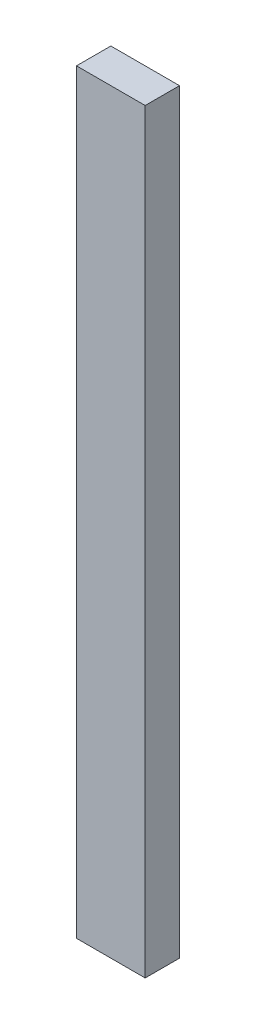
ISO-10303-21;
HEADER;
FILE_DESCRIPTION(('STEP AP214'),'2;1');
FILE_NAME('part.step','',(''),(''),'','','');
FILE_SCHEMA(('AUTOMOTIVE_DESIGN { 1 0 10303 214 1 1 1 1 }'));
ENDSEC;
DATA;
#1=APPLICATION_CONTEXT('core data for automotive mechanical design processes');
#2=APPLICATION_PROTOCOL_DEFINITION('international standard','automotive_design',2000,#1);
#3=PRODUCT_CONTEXT('',#1,'mechanical');
#4=PRODUCT('Part','Part','',(#3));
#5=PRODUCT_RELATED_PRODUCT_CATEGORY('part','',(#4));
#6=PRODUCT_DEFINITION_FORMATION('','',#4);
#7=PRODUCT_DEFINITION_CONTEXT('part definition',#1,'design');
#8=PRODUCT_DEFINITION('design','',#6,#7);
#9=PRODUCT_DEFINITION_SHAPE('','',#8);
#10=(LENGTH_UNIT() NAMED_UNIT(*) SI_UNIT(.MILLI.,.METRE.));
#11=(NAMED_UNIT(*) PLANE_ANGLE_UNIT() SI_UNIT($,.RADIAN.));
#12=(NAMED_UNIT(*) SI_UNIT($,.STERADIAN.) SOLID_ANGLE_UNIT());
#13=UNCERTAINTY_MEASURE_WITH_UNIT(LENGTH_MEASURE(1.E-05),#10,'distance_accuracy_value','');
#14=(GEOMETRIC_REPRESENTATION_CONTEXT(3) GLOBAL_UNCERTAINTY_ASSIGNED_CONTEXT((#13)) GLOBAL_UNIT_ASSIGNED_CONTEXT((#10,
#11,#12)) REPRESENTATION_CONTEXT('',''));
#15=CARTESIAN_POINT('',(0.,0.,0.));
#16=DIRECTION('',(0.,0.,1.));
#17=DIRECTION('',(1.,0.,0.));
#18=AXIS2_PLACEMENT_3D('',#15,#16,#17);
#19=CARTESIAN_POINT('',(12.7,-139.7,-12.7));
#20=DIRECTION('',(1.,0.,0.));
#21=DIRECTION('',(0.,0.,-1.));
#22=AXIS2_PLACEMENT_3D('',#19,#20,#21);
#23=PLANE('',#22);
#24=DIRECTION('',(0.,1.,0.));
#25=VECTOR('',#24,1.);
#26=CARTESIAN_POINT('',(12.7,-139.7,0.));
#27=LINE('',#26,#25);
#28=CARTESIAN_POINT('',(12.7,-139.7,0.));
#29=VERTEX_POINT('',#28);
#30=CARTESIAN_POINT('',(12.7,139.7,0.));
#31=VERTEX_POINT('',#30);
#32=EDGE_CURVE('E115',#29,#31,#27,.T.);
#33=ORIENTED_EDGE('',*,*,#32,.F.);
#34=DIRECTION('',(0.,0.,1.));
#35=VECTOR('',#34,1.);
#36=CARTESIAN_POINT('',(12.7,-139.7,-12.7));
#37=LINE('',#36,#35);
#38=CARTESIAN_POINT('',(12.7,-139.7,-12.7));
#39=VERTEX_POINT('',#38);
#40=EDGE_CURVE('E11',#39,#29,#37,.T.);
#41=ORIENTED_EDGE('',*,*,#40,.F.);
#42=DIRECTION('',(0.,1.,0.));
#43=VECTOR('',#42,1.);
#44=CARTESIAN_POINT('',(12.7,-139.7,-12.7));
#45=LINE('',#44,#43);
#46=CARTESIAN_POINT('',(12.7,139.7,-12.7));
#47=VERTEX_POINT('',#46);
#48=EDGE_CURVE('E107',#39,#47,#45,.T.);
#49=ORIENTED_EDGE('',*,*,#48,.T.);
#50=DIRECTION('',(0.,0.,1.));
#51=VECTOR('',#50,1.);
#52=CARTESIAN_POINT('',(12.7,139.7,-12.7));
#53=LINE('',#52,#51);
#54=EDGE_CURVE('E48',#47,#31,#53,.T.);
#55=ORIENTED_EDGE('',*,*,#54,.T.);
#56=EDGE_LOOP('',(#33,#41,#49,#55));
#57=FACE_BOUND('',#56,.T.);
#58=ADVANCED_FACE('F45',(#57),#23,.T.);
#59=CARTESIAN_POINT('',(-12.7,-139.7,-12.7));
#60=DIRECTION('',(0.,-1.,0.));
#61=DIRECTION('',(0.,0.,-1.));
#62=AXIS2_PLACEMENT_3D('',#59,#60,#61);
#63=PLANE('',#62);
#64=DIRECTION('',(1.,0.,0.));
#65=VECTOR('',#64,1.);
#66=CARTESIAN_POINT('',(-12.7,-139.7,0.));
#67=LINE('',#66,#65);
#68=CARTESIAN_POINT('',(-12.7,-139.7,0.));
#69=VERTEX_POINT('',#68);
#70=EDGE_CURVE('E110',#69,#29,#67,.T.);
#71=ORIENTED_EDGE('',*,*,#70,.F.);
#72=DIRECTION('',(0.,0.,1.));
#73=VECTOR('',#72,1.);
#74=CARTESIAN_POINT('',(-12.7,-139.7,-12.7));
#75=LINE('',#74,#73);
#76=CARTESIAN_POINT('',(-12.7,-139.7,-12.7));
#77=VERTEX_POINT('',#76);
#78=EDGE_CURVE('E55',#77,#69,#75,.T.);
#79=ORIENTED_EDGE('',*,*,#78,.F.);
#80=DIRECTION('',(1.,0.,0.));
#81=VECTOR('',#80,1.);
#82=CARTESIAN_POINT('',(-12.7,-139.7,-12.7));
#83=LINE('',#82,#81);
#84=EDGE_CURVE('E102',#77,#39,#83,.T.);
#85=ORIENTED_EDGE('',*,*,#84,.T.);
#86=ORIENTED_EDGE('',*,*,#40,.T.);
#87=EDGE_LOOP('',(#71,#79,#85,#86));
#88=FACE_BOUND('',#87,.T.);
#89=ADVANCED_FACE('F131',(#88),#63,.T.);
#90=CARTESIAN_POINT('',(-12.7,-139.7,-12.7));
#91=DIRECTION('',(-1.,0.,0.));
#92=DIRECTION('',(0.,0.,1.));
#93=AXIS2_PLACEMENT_3D('',#90,#91,#92);
#94=PLANE('',#93);
#95=DIRECTION('',(0.,-1.,0.));
#96=VECTOR('',#95,1.);
#97=CARTESIAN_POINT('',(-12.7,-139.7,0.));
#98=LINE('',#97,#96);
#99=CARTESIAN_POINT('',(-12.7,139.7,0.));
#100=VERTEX_POINT('',#99);
#101=EDGE_CURVE('E96',#100,#69,#98,.T.);
#102=ORIENTED_EDGE('',*,*,#101,.F.);
#103=DIRECTION('',(0.,0.,1.));
#104=VECTOR('',#103,1.);
#105=CARTESIAN_POINT('',(-12.7,139.7,-12.7));
#106=LINE('',#105,#104);
#107=CARTESIAN_POINT('',(-12.7,139.7,-12.7));
#108=VERTEX_POINT('',#107);
#109=EDGE_CURVE('E91',#108,#100,#106,.T.);
#110=ORIENTED_EDGE('',*,*,#109,.F.);
#111=DIRECTION('',(0.,-1.,0.));
#112=VECTOR('',#111,1.);
#113=CARTESIAN_POINT('',(-12.7,-139.7,-12.7));
#114=LINE('',#113,#112);
#115=EDGE_CURVE('E94',#108,#77,#114,.T.);
#116=ORIENTED_EDGE('',*,*,#115,.T.);
#117=ORIENTED_EDGE('',*,*,#78,.T.);
#118=EDGE_LOOP('',(#102,#110,#116,#117));
#119=FACE_BOUND('',#118,.T.);
#120=ADVANCED_FACE('F93',(#119),#94,.T.);
#121=CARTESIAN_POINT('',(-12.7,139.7,-12.7));
#122=DIRECTION('',(0.,1.,0.));
#123=DIRECTION('',(0.,0.,1.));
#124=AXIS2_PLACEMENT_3D('',#121,#122,#123);
#125=PLANE('',#124);
#126=DIRECTION('',(-1.,0.,0.));
#127=VECTOR('',#126,1.);
#128=CARTESIAN_POINT('',(-12.7,139.7,0.));
#129=LINE('',#128,#127);
#130=EDGE_CURVE('E119',#31,#100,#129,.T.);
#131=ORIENTED_EDGE('',*,*,#130,.F.);
#132=ORIENTED_EDGE('',*,*,#54,.F.);
#133=DIRECTION('',(-1.,0.,0.));
#134=VECTOR('',#133,1.);
#135=CARTESIAN_POINT('',(-12.7,139.7,-12.7));
#136=LINE('',#135,#134);
#137=EDGE_CURVE('E101',#47,#108,#136,.T.);
#138=ORIENTED_EDGE('',*,*,#137,.T.);
#139=ORIENTED_EDGE('',*,*,#109,.T.);
#140=EDGE_LOOP('',(#131,#132,#138,#139));
#141=FACE_BOUND('',#140,.T.);
#142=ADVANCED_FACE('F105',(#141),#125,.T.);
#143=CARTESIAN_POINT('',(0.,0.,-12.7));
#144=DIRECTION('',(0.,0.,-1.));
#145=DIRECTION('',(-1.,0.,0.));
#146=AXIS2_PLACEMENT_3D('',#143,#144,#145);
#147=PLANE('',#146);
#148=ORIENTED_EDGE('',*,*,#48,.F.);
#149=ORIENTED_EDGE('',*,*,#84,.F.);
#150=ORIENTED_EDGE('',*,*,#115,.F.);
#151=ORIENTED_EDGE('',*,*,#137,.F.);
#152=EDGE_LOOP('',(#148,#149,#150,#151));
#153=FACE_BOUND('',#152,.T.);
#154=ADVANCED_FACE('F100',(#153),#147,.T.);
#155=CARTESIAN_POINT('',(0.,0.,0.));
#156=DIRECTION('',(0.,0.,-1.));
#157=DIRECTION('',(-1.,0.,0.));
#158=AXIS2_PLACEMENT_3D('',#155,#156,#157);
#159=PLANE('',#158);
#160=ORIENTED_EDGE('',*,*,#32,.T.);
#161=ORIENTED_EDGE('',*,*,#130,.T.);
#162=ORIENTED_EDGE('',*,*,#101,.T.);
#163=ORIENTED_EDGE('',*,*,#70,.T.);
#164=EDGE_LOOP('',(#160,#161,#162,#163));
#165=FACE_BOUND('',#164,.T.);
#166=ADVANCED_FACE('F130',(#165),#159,.F.);
#167=CLOSED_SHELL('',(#58,#89,#120,#142,#154,#166));
#168=MANIFOLD_SOLID_BREP('B2',#167);
#169=ADVANCED_BREP_SHAPE_REPRESENTATION('',(#18,#168),#14);
#170=SHAPE_DEFINITION_REPRESENTATION(#9,#169);
ENDSEC;
END-ISO-10303-21;
